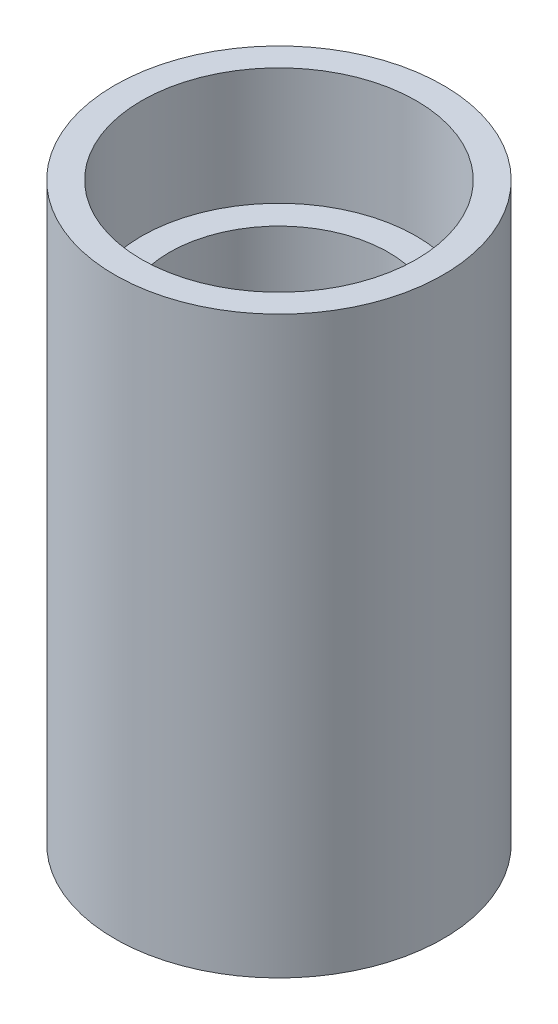
ISO-10303-21;
HEADER;
FILE_DESCRIPTION(('STEP AP214'),'2;1');
FILE_NAME('part.step','',(''),(''),'','','');
FILE_SCHEMA(('AUTOMOTIVE_DESIGN { 1 0 10303 214 1 1 1 1 }'));
ENDSEC;
DATA;
#1=APPLICATION_CONTEXT('core data for automotive mechanical design processes');
#2=APPLICATION_PROTOCOL_DEFINITION('international standard','automotive_design',2000,#1);
#3=PRODUCT_CONTEXT('',#1,'mechanical');
#4=PRODUCT('Part','Part','',(#3));
#5=PRODUCT_RELATED_PRODUCT_CATEGORY('part','',(#4));
#6=PRODUCT_DEFINITION_FORMATION('','',#4);
#7=PRODUCT_DEFINITION_CONTEXT('part definition',#1,'design');
#8=PRODUCT_DEFINITION('design','',#6,#7);
#9=PRODUCT_DEFINITION_SHAPE('','',#8);
#10=(LENGTH_UNIT() NAMED_UNIT(*) SI_UNIT(.MILLI.,.METRE.));
#11=(NAMED_UNIT(*) PLANE_ANGLE_UNIT() SI_UNIT($,.RADIAN.));
#12=(NAMED_UNIT(*) SI_UNIT($,.STERADIAN.) SOLID_ANGLE_UNIT());
#13=UNCERTAINTY_MEASURE_WITH_UNIT(LENGTH_MEASURE(1.E-05),#10,'distance_accuracy_value','');
#14=(GEOMETRIC_REPRESENTATION_CONTEXT(3) GLOBAL_UNCERTAINTY_ASSIGNED_CONTEXT((#13)) GLOBAL_UNIT_ASSIGNED_CONTEXT((#10,
#11,#12)) REPRESENTATION_CONTEXT('',''));
#15=CARTESIAN_POINT('',(0.,0.,0.));
#16=DIRECTION('',(0.,0.,1.));
#17=DIRECTION('',(1.,0.,0.));
#18=AXIS2_PLACEMENT_3D('',#15,#16,#17);
#19=CARTESIAN_POINT('',(0.,55.7467725164634,0.));
#20=DIRECTION('',(0.,1.,0.));
#21=DIRECTION('',(-1.,0.,0.));
#22=AXIS2_PLACEMENT_3D('',#19,#20,#21);
#23=CYLINDRICAL_SURFACE('',#22,25.4);
#24=CARTESIAN_POINT('',(0.,0.,0.));
#25=DIRECTION('',(0.,1.,0.));
#26=DIRECTION('',(-1.,0.,0.));
#27=AXIS2_PLACEMENT_3D('',#24,#25,#26);
#28=CIRCLE('',#27,25.4);
#29=CARTESIAN_POINT('',(-25.4,0.,0.));
#30=VERTEX_POINT('',#29);
#31=EDGE_CURVE('E59',#30,#30,#28,.T.);
#32=ORIENTED_EDGE('',*,*,#31,.F.);
#33=EDGE_LOOP('',(#32));
#34=FACE_BOUND('',#33,.T.);
#35=CARTESIAN_POINT('',(0.,106.1466,0.));
#36=DIRECTION('',(0.,1.,0.));
#37=DIRECTION('',(-1.,0.,0.));
#38=AXIS2_PLACEMENT_3D('',#35,#36,#37);
#39=CIRCLE('',#38,25.4);
#40=CARTESIAN_POINT('',(-25.4,106.1466,0.));
#41=VERTEX_POINT('',#40);
#42=EDGE_CURVE('E10',#41,#41,#39,.T.);
#43=ORIENTED_EDGE('',*,*,#42,.T.);
#44=EDGE_LOOP('',(#43));
#45=FACE_BOUND('',#44,.T.);
#46=ADVANCED_FACE('F37',(#34,#45),#23,.F.);
#47=CARTESIAN_POINT('',(25.4,106.1466,0.));
#48=DIRECTION('',(0.,-1.,0.));
#49=DIRECTION('',(1.,0.,0.));
#50=AXIS2_PLACEMENT_3D('',#47,#48,#49);
#51=PLANE('',#50);
#52=ORIENTED_EDGE('',*,*,#42,.F.);
#53=EDGE_LOOP('',(#52));
#54=FACE_BOUND('',#53,.T.);
#55=CARTESIAN_POINT('',(0.,106.1466,0.));
#56=DIRECTION('',(0.,1.,0.));
#57=DIRECTION('',(-1.,0.,0.));
#58=AXIS2_PLACEMENT_3D('',#55,#56,#57);
#59=CIRCLE('',#58,31.877);
#60=CARTESIAN_POINT('',(-31.877,106.1466,0.));
#61=VERTEX_POINT('',#60);
#62=EDGE_CURVE('E43',#61,#61,#59,.T.);
#63=ORIENTED_EDGE('',*,*,#62,.T.);
#64=EDGE_LOOP('',(#63));
#65=FACE_BOUND('',#64,.T.);
#66=ADVANCED_FACE('F66',(#54,#65),#51,.F.);
#67=CARTESIAN_POINT('',(0.,55.7467725164634,0.));
#68=DIRECTION('',(0.,1.,0.));
#69=DIRECTION('',(-1.,0.,0.));
#70=AXIS2_PLACEMENT_3D('',#67,#68,#69);
#71=CYLINDRICAL_SURFACE('',#70,31.877);
#72=ORIENTED_EDGE('',*,*,#62,.F.);
#73=EDGE_LOOP('',(#72));
#74=FACE_BOUND('',#73,.T.);
#75=CARTESIAN_POINT('',(0.,133.35,0.));
#76=DIRECTION('',(0.,1.,0.));
#77=DIRECTION('',(-1.,0.,0.));
#78=AXIS2_PLACEMENT_3D('',#75,#76,#77);
#79=CIRCLE('',#78,31.877);
#80=CARTESIAN_POINT('',(-31.877,133.35,0.));
#81=VERTEX_POINT('',#80);
#82=EDGE_CURVE('E47',#81,#81,#79,.T.);
#83=ORIENTED_EDGE('',*,*,#82,.T.);
#84=EDGE_LOOP('',(#83));
#85=FACE_BOUND('',#84,.T.);
#86=ADVANCED_FACE('F70',(#74,#85),#71,.F.);
#87=CARTESIAN_POINT('',(31.877,133.35,0.));
#88=DIRECTION('',(0.,-1.,0.));
#89=DIRECTION('',(1.,0.,0.));
#90=AXIS2_PLACEMENT_3D('',#87,#88,#89);
#91=PLANE('',#90);
#92=ORIENTED_EDGE('',*,*,#82,.F.);
#93=EDGE_LOOP('',(#92));
#94=FACE_BOUND('',#93,.T.);
#95=CARTESIAN_POINT('',(0.,133.35,0.));
#96=DIRECTION('',(0.,1.,0.));
#97=DIRECTION('',(-1.,0.,0.));
#98=AXIS2_PLACEMENT_3D('',#95,#96,#97);
#99=CIRCLE('',#98,38.1);
#100=CARTESIAN_POINT('',(-38.1,133.35,0.));
#101=VERTEX_POINT('',#100);
#102=EDGE_CURVE('E51',#101,#101,#99,.T.);
#103=ORIENTED_EDGE('',*,*,#102,.T.);
#104=EDGE_LOOP('',(#103));
#105=FACE_BOUND('',#104,.T.);
#106=ADVANCED_FACE('F75',(#94,#105),#91,.F.);
#107=CARTESIAN_POINT('',(0.,55.7467725164634,0.));
#108=DIRECTION('',(0.,1.,0.));
#109=DIRECTION('',(-1.,0.,0.));
#110=AXIS2_PLACEMENT_3D('',#107,#108,#109);
#111=CYLINDRICAL_SURFACE('',#110,38.1);
#112=ORIENTED_EDGE('',*,*,#102,.F.);
#113=EDGE_LOOP('',(#112));
#114=FACE_BOUND('',#113,.T.);
#115=CARTESIAN_POINT('',(0.,0.,0.));
#116=DIRECTION('',(0.,1.,0.));
#117=DIRECTION('',(-1.,0.,0.));
#118=AXIS2_PLACEMENT_3D('',#115,#116,#117);
#119=CIRCLE('',#118,38.1);
#120=CARTESIAN_POINT('',(-38.1,0.,0.));
#121=VERTEX_POINT('',#120);
#122=EDGE_CURVE('E56',#121,#121,#119,.T.);
#123=ORIENTED_EDGE('',*,*,#122,.T.);
#124=EDGE_LOOP('',(#123));
#125=FACE_BOUND('',#124,.T.);
#126=ADVANCED_FACE('F81',(#114,#125),#111,.T.);
#127=CARTESIAN_POINT('',(25.4,0.,0.));
#128=DIRECTION('',(0.,1.,0.));
#129=DIRECTION('',(-1.,0.,0.));
#130=AXIS2_PLACEMENT_3D('',#127,#128,#129);
#131=PLANE('',#130);
#132=ORIENTED_EDGE('',*,*,#122,.F.);
#133=EDGE_LOOP('',(#132));
#134=FACE_BOUND('',#133,.T.);
#135=ORIENTED_EDGE('',*,*,#31,.T.);
#136=EDGE_LOOP('',(#135));
#137=FACE_BOUND('',#136,.T.);
#138=ADVANCED_FACE('F63',(#134,#137),#131,.F.);
#139=CLOSED_SHELL('',(#46,#66,#86,#106,#126,#138));
#140=MANIFOLD_SOLID_BREP('B2',#139);
#141=ADVANCED_BREP_SHAPE_REPRESENTATION('',(#18,#140),#14);
#142=SHAPE_DEFINITION_REPRESENTATION(#9,#141);
ENDSEC;
END-ISO-10303-21;
